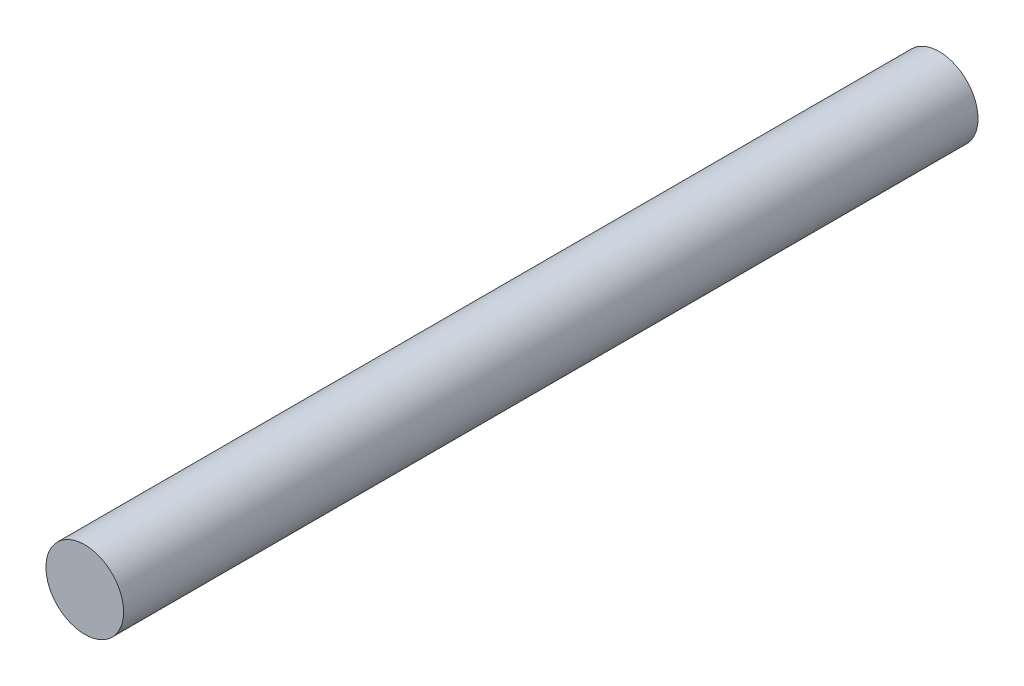
ISO-10303-21;
HEADER;
FILE_DESCRIPTION(('STEP AP214'),'2;1');
FILE_NAME('part.step','',(''),(''),'','','');
FILE_SCHEMA(('AUTOMOTIVE_DESIGN { 1 0 10303 214 1 1 1 1 }'));
ENDSEC;
DATA;
#1=APPLICATION_CONTEXT('core data for automotive mechanical design processes');
#2=APPLICATION_PROTOCOL_DEFINITION('international standard','automotive_design',2000,#1);
#3=PRODUCT_CONTEXT('',#1,'mechanical');
#4=PRODUCT('Part','Part','',(#3));
#5=PRODUCT_RELATED_PRODUCT_CATEGORY('part','',(#4));
#6=PRODUCT_DEFINITION_FORMATION('','',#4);
#7=PRODUCT_DEFINITION_CONTEXT('part definition',#1,'design');
#8=PRODUCT_DEFINITION('design','',#6,#7);
#9=PRODUCT_DEFINITION_SHAPE('','',#8);
#10=(LENGTH_UNIT() NAMED_UNIT(*) SI_UNIT(.MILLI.,.METRE.));
#11=(NAMED_UNIT(*) PLANE_ANGLE_UNIT() SI_UNIT($,.RADIAN.));
#12=(NAMED_UNIT(*) SI_UNIT($,.STERADIAN.) SOLID_ANGLE_UNIT());
#13=UNCERTAINTY_MEASURE_WITH_UNIT(LENGTH_MEASURE(1.E-05),#10,'distance_accuracy_value','');
#14=(GEOMETRIC_REPRESENTATION_CONTEXT(3) GLOBAL_UNCERTAINTY_ASSIGNED_CONTEXT((#13)) GLOBAL_UNIT_ASSIGNED_CONTEXT((#10,
#11,#12)) REPRESENTATION_CONTEXT('',''));
#15=CARTESIAN_POINT('',(0.,0.,0.));
#16=DIRECTION('',(0.,0.,1.));
#17=DIRECTION('',(1.,0.,0.));
#18=AXIS2_PLACEMENT_3D('',#15,#16,#17);
#19=CARTESIAN_POINT('',(0.,0.,22.));
#20=DIRECTION('',(0.,0.,-1.));
#21=DIRECTION('',(-1.,0.,0.));
#22=AXIS2_PLACEMENT_3D('',#19,#20,#21);
#23=CYLINDRICAL_SURFACE('',#22,1.);
#24=CARTESIAN_POINT('',(0.,0.,22.));
#25=DIRECTION('',(0.,0.,1.));
#26=DIRECTION('',(1.,0.,0.));
#27=AXIS2_PLACEMENT_3D('',#24,#25,#26);
#28=CIRCLE('',#27,1.);
#29=CARTESIAN_POINT('',(1.,0.,22.));
#30=VERTEX_POINT('',#29);
#31=EDGE_CURVE('E10',#30,#30,#28,.T.);
#32=ORIENTED_EDGE('',*,*,#31,.F.);
#33=EDGE_LOOP('',(#32));
#34=FACE_BOUND('',#33,.T.);
#35=CARTESIAN_POINT('',(0.,0.,0.));
#36=DIRECTION('',(0.,0.,1.));
#37=DIRECTION('',(1.,0.,0.));
#38=AXIS2_PLACEMENT_3D('',#35,#36,#37);
#39=CIRCLE('',#38,1.);
#40=CARTESIAN_POINT('',(1.,0.,0.));
#41=VERTEX_POINT('',#40);
#42=EDGE_CURVE('E36',#41,#41,#39,.T.);
#43=ORIENTED_EDGE('',*,*,#42,.T.);
#44=EDGE_LOOP('',(#43));
#45=FACE_BOUND('',#44,.T.);
#46=ADVANCED_FACE('F33',(#34,#45),#23,.T.);
#47=CARTESIAN_POINT('',(0.,0.,22.));
#48=DIRECTION('',(0.,0.,1.));
#49=DIRECTION('',(1.,0.,0.));
#50=AXIS2_PLACEMENT_3D('',#47,#48,#49);
#51=PLANE('',#50);
#52=ORIENTED_EDGE('',*,*,#31,.T.);
#53=EDGE_LOOP('',(#52));
#54=FACE_BOUND('',#53,.T.);
#55=ADVANCED_FACE('F48',(#54),#51,.T.);
#56=CARTESIAN_POINT('',(0.,0.,0.));
#57=DIRECTION('',(0.,0.,1.));
#58=DIRECTION('',(1.,0.,0.));
#59=AXIS2_PLACEMENT_3D('',#56,#57,#58);
#60=PLANE('',#59);
#61=ORIENTED_EDGE('',*,*,#42,.F.);
#62=EDGE_LOOP('',(#61));
#63=FACE_BOUND('',#62,.T.);
#64=ADVANCED_FACE('F46',(#63),#60,.F.);
#65=CLOSED_SHELL('',(#46,#55,#64));
#66=MANIFOLD_SOLID_BREP('B2',#65);
#67=ADVANCED_BREP_SHAPE_REPRESENTATION('',(#18,#66),#14);
#68=SHAPE_DEFINITION_REPRESENTATION(#9,#67);
ENDSEC;
END-ISO-10303-21;
